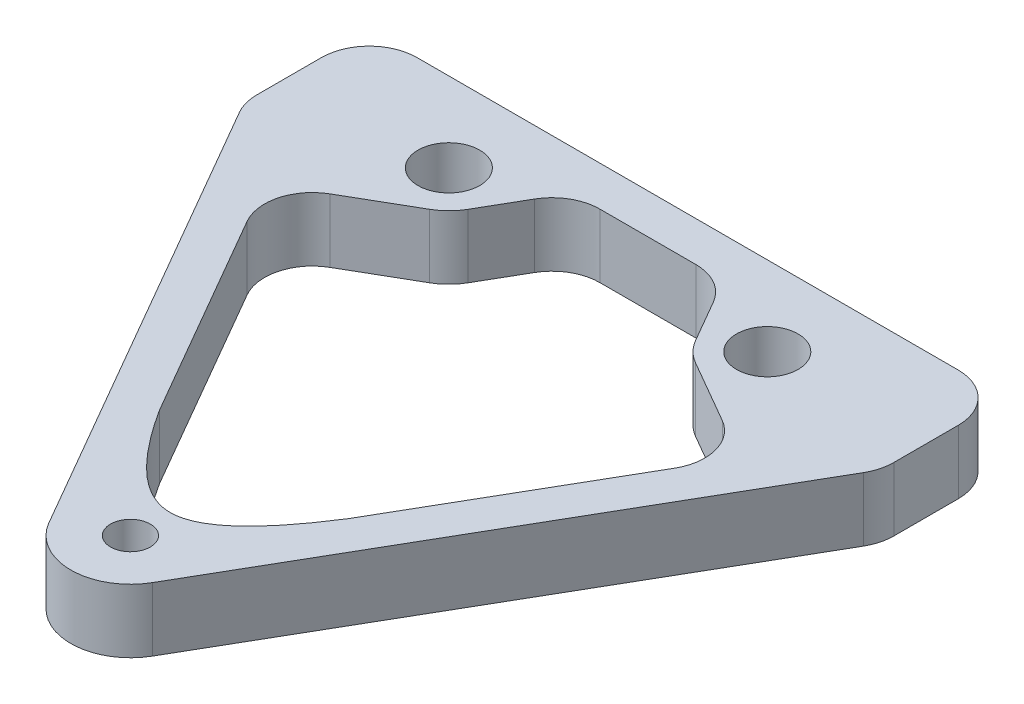
ISO-10303-21;
HEADER;
FILE_DESCRIPTION(('STEP AP214'),'2;1');
FILE_NAME('part.step','',(''),(''),'','','');
FILE_SCHEMA(('AUTOMOTIVE_DESIGN { 1 0 10303 214 1 1 1 1 }'));
ENDSEC;
DATA;
#1=APPLICATION_CONTEXT('core data for automotive mechanical design processes');
#2=APPLICATION_PROTOCOL_DEFINITION('international standard','automotive_design',2000,#1);
#3=PRODUCT_CONTEXT('',#1,'mechanical');
#4=PRODUCT('Part','Part','',(#3));
#5=PRODUCT_RELATED_PRODUCT_CATEGORY('part','',(#4));
#6=PRODUCT_DEFINITION_FORMATION('','',#4);
#7=PRODUCT_DEFINITION_CONTEXT('part definition',#1,'design');
#8=PRODUCT_DEFINITION('design','',#6,#7);
#9=PRODUCT_DEFINITION_SHAPE('','',#8);
#10=(LENGTH_UNIT() NAMED_UNIT(*) SI_UNIT(.MILLI.,.METRE.));
#11=(NAMED_UNIT(*) PLANE_ANGLE_UNIT() SI_UNIT($,.RADIAN.));
#12=(NAMED_UNIT(*) SI_UNIT($,.STERADIAN.) SOLID_ANGLE_UNIT());
#13=UNCERTAINTY_MEASURE_WITH_UNIT(LENGTH_MEASURE(1.E-05),#10,'distance_accuracy_value','');
#14=(GEOMETRIC_REPRESENTATION_CONTEXT(3) GLOBAL_UNCERTAINTY_ASSIGNED_CONTEXT((#13)) GLOBAL_UNIT_ASSIGNED_CONTEXT((#10,
#11,#12)) REPRESENTATION_CONTEXT('',''));
#15=CARTESIAN_POINT('',(0.,0.,0.));
#16=DIRECTION('',(0.,0.,1.));
#17=DIRECTION('',(1.,0.,0.));
#18=AXIS2_PLACEMENT_3D('',#15,#16,#17);
#19=CARTESIAN_POINT('',(0.,5.08,0.));
#20=DIRECTION('',(0.,1.,0.));
#21=DIRECTION('',(0.,0.,1.));
#22=AXIS2_PLACEMENT_3D('',#19,#20,#21);
#23=PLANE('',#22);
#24=CARTESIAN_POINT('',(0.,5.08,44.45));
#25=DIRECTION('',(0.,1.,0.));
#26=DIRECTION('',(0.,0.,1.));
#27=AXIS2_PLACEMENT_3D('',#24,#25,#26);
#28=CIRCLE('',#27,1.5875);
#29=CARTESIAN_POINT('',(0.,5.08,46.0375));
#30=VERTEX_POINT('',#29);
#31=EDGE_CURVE('E431',#30,#30,#28,.T.);
#32=ORIENTED_EDGE('',*,*,#31,.F.);
#33=EDGE_LOOP('',(#32));
#34=FACE_BOUND('',#33,.T.);
#35=CARTESIAN_POINT('',(-12.7,5.08,6.35));
#36=DIRECTION('',(0.,1.,0.));
#37=DIRECTION('',(0.,0.,1.));
#38=AXIS2_PLACEMENT_3D('',#35,#36,#37);
#39=CIRCLE('',#38,2.45745);
#40=CARTESIAN_POINT('',(-12.7,5.08,8.80745));
#41=VERTEX_POINT('',#40);
#42=EDGE_CURVE('E425',#41,#41,#39,.T.);
#43=ORIENTED_EDGE('',*,*,#42,.F.);
#44=EDGE_LOOP('',(#43));
#45=FACE_BOUND('',#44,.T.);
#46=CARTESIAN_POINT('',(12.7,5.08,6.35));
#47=DIRECTION('',(0.,1.,0.));
#48=DIRECTION('',(0.,0.,1.));
#49=AXIS2_PLACEMENT_3D('',#46,#47,#48);
#50=CIRCLE('',#49,2.45745);
#51=CARTESIAN_POINT('',(12.7,5.08,8.80745));
#52=VERTEX_POINT('',#51);
#53=EDGE_CURVE('E419',#52,#52,#50,.T.);
#54=ORIENTED_EDGE('',*,*,#53,.F.);
#55=EDGE_LOOP('',(#54));
#56=FACE_BOUND('',#55,.T.);
#57=DIRECTION('',(-0.499999999999998,0.,0.86602540378444));
#58=VECTOR('',#57,1.);
#59=CARTESIAN_POINT('',(23.3718605846325,5.08,13.4937499999999));
#60=LINE('',#59,#58);
#61=CARTESIAN_POINT('',(24.8895567884187,5.08,10.8650230645877));
#62=VERTEX_POINT('',#61);
#63=CARTESIAN_POINT('',(4.1244459855234,5.08,46.83125));
#64=VERTEX_POINT('',#63);
#65=EDGE_CURVE('E411',#62,#64,#60,.T.);
#66=ORIENTED_EDGE('',*,*,#65,.F.);
#67=CARTESIAN_POINT('',(21.59,5.08,8.96002306458772));
#68=DIRECTION('',(0.,1.,0.));
#69=DIRECTION('',(0.,0.,1.));
#70=AXIS2_PLACEMENT_3D('',#67,#68,#69);
#71=CIRCLE('',#70,3.81);
#72=CARTESIAN_POINT('',(25.4,5.08,8.96002306458772));
#73=VERTEX_POINT('',#72);
#74=EDGE_CURVE('E355',#62,#73,#71,.T.);
#75=ORIENTED_EDGE('',*,*,#74,.T.);
#76=DIRECTION('',(0.,0.,1.));
#77=VECTOR('',#76,1.);
#78=CARTESIAN_POINT('',(25.4,5.08,0.));
#79=LINE('',#78,#77);
#80=CARTESIAN_POINT('',(25.4,5.08,3.81));
#81=VERTEX_POINT('',#80);
#82=EDGE_CURVE('E408',#81,#73,#79,.T.);
#83=ORIENTED_EDGE('',*,*,#82,.F.);
#84=CARTESIAN_POINT('',(21.59,5.08,3.81));
#85=DIRECTION('',(0.,1.,0.));
#86=DIRECTION('',(0.,0.,1.));
#87=AXIS2_PLACEMENT_3D('',#84,#85,#86);
#88=CIRCLE('',#87,3.81);
#89=CARTESIAN_POINT('',(21.59,5.08,0.));
#90=VERTEX_POINT('',#89);
#91=EDGE_CURVE('E357',#81,#90,#88,.T.);
#92=ORIENTED_EDGE('',*,*,#91,.T.);
#93=DIRECTION('',(1.,0.,0.));
#94=VECTOR('',#93,1.);
#95=CARTESIAN_POINT('',(0.,5.08,0.));
#96=LINE('',#95,#94);
#97=CARTESIAN_POINT('',(-21.59,5.08,0.));
#98=VERTEX_POINT('',#97);
#99=EDGE_CURVE('E405',#98,#90,#96,.T.);
#100=ORIENTED_EDGE('',*,*,#99,.F.);
#101=CARTESIAN_POINT('',(-21.59,5.08,3.81));
#102=DIRECTION('',(0.,1.,0.));
#103=DIRECTION('',(0.,0.,1.));
#104=AXIS2_PLACEMENT_3D('',#101,#102,#103);
#105=CIRCLE('',#104,3.81);
#106=CARTESIAN_POINT('',(-25.4,5.08,3.81));
#107=VERTEX_POINT('',#106);
#108=EDGE_CURVE('E359',#98,#107,#105,.T.);
#109=ORIENTED_EDGE('',*,*,#108,.T.);
#110=DIRECTION('',(0.,0.,1.));
#111=VECTOR('',#110,1.);
#112=CARTESIAN_POINT('',(-25.4,5.08,0.));
#113=LINE('',#112,#111);
#114=CARTESIAN_POINT('',(-25.4,5.08,8.96002306458773));
#115=VERTEX_POINT('',#114);
#116=EDGE_CURVE('E384',#107,#115,#113,.T.);
#117=ORIENTED_EDGE('',*,*,#116,.T.);
#118=CARTESIAN_POINT('',(-21.59,5.08,8.96002306458773));
#119=DIRECTION('',(0.,1.,0.));
#120=DIRECTION('',(0.,0.,1.));
#121=AXIS2_PLACEMENT_3D('',#118,#119,#120);
#122=CIRCLE('',#121,3.81);
#123=CARTESIAN_POINT('',(-24.8895567884187,5.08,10.8650230645877));
#124=VERTEX_POINT('',#123);
#125=EDGE_CURVE('E361',#115,#124,#122,.T.);
#126=ORIENTED_EDGE('',*,*,#125,.T.);
#127=DIRECTION('',(0.499999999999998,0.,0.86602540378444));
#128=VECTOR('',#127,1.);
#129=CARTESIAN_POINT('',(-23.3718605846325,5.08,13.4937499999999));
#130=LINE('',#129,#128);
#131=CARTESIAN_POINT('',(-4.1244459855234,5.08,46.83125));
#132=VERTEX_POINT('',#131);
#133=EDGE_CURVE('E388',#124,#132,#130,.T.);
#134=ORIENTED_EDGE('',*,*,#133,.T.);
#135=CARTESIAN_POINT('',(0.,5.08,44.45));
#136=DIRECTION('',(0.,1.,0.));
#137=DIRECTION('',(0.,0.,1.));
#138=AXIS2_PLACEMENT_3D('',#135,#136,#137);
#139=CIRCLE('',#138,4.7625);
#140=EDGE_CURVE('E413',#132,#64,#139,.T.);
#141=ORIENTED_EDGE('',*,*,#140,.T.);
#142=EDGE_LOOP('',(#66,#75,#83,#92,#100,#109,#117,#126,#134,#141));
#143=FACE_BOUND('',#142,.T.);
#144=DIRECTION('',(0.499999999999998,0.,-0.86602540378444));
#145=VECTOR('',#144,1.);
#146=CARTESIAN_POINT('',(20.6222299276169,5.08,11.9062499999999));
#147=LINE('',#146,#145);
#148=CARTESIAN_POINT('',(7.50662638811654,5.08,34.6231417023449));
#149=VERTEX_POINT('',#148);
#150=CARTESIAN_POINT('',(17.0470992706013,5.08,18.098557941648));
#151=VERTEX_POINT('',#150);
#152=EDGE_CURVE('E463',#149,#151,#147,.T.);
#153=ORIENTED_EDGE('',*,*,#152,.F.);
#154=CARTESIAN_POINT('',(11.7999076642539,5.08,27.1869604008907));
#155=CARTESIAN_POINT('',(9.15149818445331,5.08,31.7741401791523));
#156=CARTESIAN_POINT('',(0.,5.08,50.7758598208477));
#157=CARTESIAN_POINT('',(-9.15149818445341,5.08,31.7741401791524));
#158=CARTESIAN_POINT('',(-11.7999076642539,5.08,27.1869604008907));
#159=B_SPLINE_CURVE_WITH_KNOTS('',3,(#154,#155,#156,#157,#158),.UNSPECIFIED.,.F.,.F.,(4,1,4),
(0.,0.5,1.),.UNSPECIFIED.);
#160=CARTESIAN_POINT('',(-7.50662638811593,5.08,34.6231417023459));
#161=VERTEX_POINT('',#160);
#162=EDGE_CURVE('E203',#149,#161,#159,.T.);
#163=ORIENTED_EDGE('',*,*,#162,.T.);
#164=DIRECTION('',(0.499999999999998,0.,0.86602540378444));
#165=VECTOR('',#164,1.);
#166=CARTESIAN_POINT('',(-20.6222299276169,5.08,11.9062499999999));
#167=LINE('',#166,#165);
#168=CARTESIAN_POINT('',(-17.0470992706013,5.08,18.098557941648));
#169=VERTEX_POINT('',#168);
#170=EDGE_CURVE('E220',#169,#161,#167,.T.);
#171=ORIENTED_EDGE('',*,*,#170,.F.);
#172=CARTESIAN_POINT('',(-13.7475424821826,5.08,16.1935579416481));
#173=DIRECTION('',(0.,1.,0.));
#174=DIRECTION('',(0.,0.,1.));
#175=AXIS2_PLACEMENT_3D('',#172,#173,#174);
#176=CIRCLE('',#175,3.81);
#177=CARTESIAN_POINT('',(-15.6525424821826,5.08,12.8940011532293));
#178=VERTEX_POINT('',#177);
#179=EDGE_CURVE('E316',#169,#178,#176,.F.);
#180=ORIENTED_EDGE('',*,*,#179,.T.);
#181=DIRECTION('',(-0.86602540378444,0.,0.499999999999998));
#182=VECTOR('',#181,1.);
#183=CARTESIAN_POINT('',(1.67013065701561,5.08,2.89275115322944));
#184=LINE('',#183,#182);
#185=CARTESIAN_POINT('',(-10.6045,5.08,9.97951246726059));
#186=VERTEX_POINT('',#185);
#187=EDGE_CURVE('E222',#186,#178,#184,.T.);
#188=ORIENTED_EDGE('',*,*,#187,.F.);
#189=CARTESIAN_POINT('',(-12.7,5.08,6.35));
#190=DIRECTION('',(0.,1.,0.));
#191=DIRECTION('',(0.,0.,1.));
#192=AXIS2_PLACEMENT_3D('',#189,#190,#191);
#193=CIRCLE('',#192,4.191);
#194=CARTESIAN_POINT('',(-9.07048753273941,5.08,8.44549999999999));
#195=VERTEX_POINT('',#194);
#196=EDGE_CURVE('E446',#186,#195,#193,.T.);
#197=ORIENTED_EDGE('',*,*,#196,.T.);
#198=DIRECTION('',(0.499999999999997,0.,-0.86602540378444));
#199=VECTOR('',#198,1.);
#200=CARTESIAN_POINT('',(-3.14585687572386,5.08,-1.81626131403119));
#201=LINE('',#200,#199);
#202=CARTESIAN_POINT('',(-7.12741520178175,5.08,5.08000000000002));
#203=VERTEX_POINT('',#202);
#204=EDGE_CURVE('E449',#195,#203,#201,.T.);
#205=ORIENTED_EDGE('',*,*,#204,.T.);
#206=CARTESIAN_POINT('',(-3.82785841336303,5.08,6.985));
#207=DIRECTION('',(0.,1.,0.));
#208=DIRECTION('',(0.,0.,1.));
#209=AXIS2_PLACEMENT_3D('',#206,#207,#208);
#210=CIRCLE('',#209,3.81);
#211=CARTESIAN_POINT('',(-3.82785841336303,5.08,3.175));
#212=VERTEX_POINT('',#211);
#213=EDGE_CURVE('E322',#203,#212,#210,.F.);
#214=ORIENTED_EDGE('',*,*,#213,.T.);
#215=DIRECTION('',(-1.,0.,0.));
#216=VECTOR('',#215,1.);
#217=CARTESIAN_POINT('',(0.,5.08,3.175));
#218=LINE('',#217,#216);
#219=CARTESIAN_POINT('',(3.82785841336303,5.08,3.175));
#220=VERTEX_POINT('',#219);
#221=EDGE_CURVE('E452',#220,#212,#218,.T.);
#222=ORIENTED_EDGE('',*,*,#221,.F.);
#223=CARTESIAN_POINT('',(3.82785841336303,5.08,6.985));
#224=DIRECTION('',(0.,1.,0.));
#225=DIRECTION('',(0.,0.,1.));
#226=AXIS2_PLACEMENT_3D('',#223,#224,#225);
#227=CIRCLE('',#226,3.81);
#228=CARTESIAN_POINT('',(7.12741520178175,5.08,5.08000000000001));
#229=VERTEX_POINT('',#228);
#230=EDGE_CURVE('E57',#220,#229,#227,.F.);
#231=ORIENTED_EDGE('',*,*,#230,.T.);
#232=DIRECTION('',(0.499999999999998,0.,0.86602540378444));
#233=VECTOR('',#232,1.);
#234=CARTESIAN_POINT('',(3.14585687572386,5.08,-1.81626131403119));
#235=LINE('',#234,#233);
#236=CARTESIAN_POINT('',(9.07048753273941,5.08,8.44549999999999));
#237=VERTEX_POINT('',#236);
#238=EDGE_CURVE('E455',#229,#237,#235,.T.);
#239=ORIENTED_EDGE('',*,*,#238,.T.);
#240=CARTESIAN_POINT('',(12.7,5.08,6.35));
#241=DIRECTION('',(0.,1.,0.));
#242=DIRECTION('',(0.,0.,1.));
#243=AXIS2_PLACEMENT_3D('',#240,#241,#242);
#244=CIRCLE('',#243,4.191);
#245=CARTESIAN_POINT('',(10.6045,5.08,9.97951246726059));
#246=VERTEX_POINT('',#245);
#247=EDGE_CURVE('E457',#237,#246,#244,.T.);
#248=ORIENTED_EDGE('',*,*,#247,.T.);
#249=DIRECTION('',(0.86602540378444,0.,0.499999999999997));
#250=VECTOR('',#249,1.);
#251=CARTESIAN_POINT('',(-1.67013065701561,5.08,2.89275115322944));
#252=LINE('',#251,#250);
#253=CARTESIAN_POINT('',(15.6525424821826,5.08,12.8940011532293));
#254=VERTEX_POINT('',#253);
#255=EDGE_CURVE('E460',#246,#254,#252,.T.);
#256=ORIENTED_EDGE('',*,*,#255,.T.);
#257=CARTESIAN_POINT('',(13.7475424821826,5.08,16.1935579416481));
#258=DIRECTION('',(0.,1.,0.));
#259=DIRECTION('',(0.,0.,1.));
#260=AXIS2_PLACEMENT_3D('',#257,#258,#259);
#261=CIRCLE('',#260,3.81);
#262=EDGE_CURVE('E43',#254,#151,#261,.F.);
#263=ORIENTED_EDGE('',*,*,#262,.T.);
#264=EDGE_LOOP('',(#153,#163,#171,#180,#188,#197,#205,#214,#222,#231,#239,#248,#256,#263));
#265=FACE_BOUND('',#264,.T.);
#266=ADVANCED_FACE('F35',(#34,#45,#56,#143,#265),#23,.T.);
#267=CARTESIAN_POINT('',(0.,0.,0.));
#268=DIRECTION('',(0.,1.,0.));
#269=DIRECTION('',(0.,0.,1.));
#270=AXIS2_PLACEMENT_3D('',#267,#268,#269);
#271=PLANE('',#270);
#272=DIRECTION('',(0.,0.,1.));
#273=VECTOR('',#272,1.);
#274=CARTESIAN_POINT('',(25.4,0.,0.));
#275=LINE('',#274,#273);
#276=CARTESIAN_POINT('',(25.4,0.,3.81));
#277=VERTEX_POINT('',#276);
#278=CARTESIAN_POINT('',(25.4,0.,8.96002306458772));
#279=VERTEX_POINT('',#278);
#280=EDGE_CURVE('E392',#277,#279,#275,.T.);
#281=ORIENTED_EDGE('',*,*,#280,.T.);
#282=CARTESIAN_POINT('',(21.59,0.,8.96002306458772));
#283=DIRECTION('',(0.,1.,0.));
#284=DIRECTION('',(0.,0.,1.));
#285=AXIS2_PLACEMENT_3D('',#282,#283,#284);
#286=CIRCLE('',#285,3.81);
#287=CARTESIAN_POINT('',(24.8895567884187,0.,10.8650230645877));
#288=VERTEX_POINT('',#287);
#289=EDGE_CURVE('E365',#279,#288,#286,.F.);
#290=ORIENTED_EDGE('',*,*,#289,.T.);
#291=DIRECTION('',(-0.499999999999998,0.,0.86602540378444));
#292=VECTOR('',#291,1.);
#293=CARTESIAN_POINT('',(23.3718605846325,0.,13.4937499999999));
#294=LINE('',#293,#292);
#295=CARTESIAN_POINT('',(4.1244459855234,0.,46.83125));
#296=VERTEX_POINT('',#295);
#297=EDGE_CURVE('E395',#288,#296,#294,.T.);
#298=ORIENTED_EDGE('',*,*,#297,.T.);
#299=CARTESIAN_POINT('',(0.,0.,44.45));
#300=DIRECTION('',(0.,1.,0.));
#301=DIRECTION('',(0.,0.,1.));
#302=AXIS2_PLACEMENT_3D('',#299,#300,#301);
#303=CIRCLE('',#302,4.7625);
#304=CARTESIAN_POINT('',(-4.1244459855234,0.,46.83125));
#305=VERTEX_POINT('',#304);
#306=EDGE_CURVE('E397',#305,#296,#303,.T.);
#307=ORIENTED_EDGE('',*,*,#306,.F.);
#308=DIRECTION('',(0.499999999999998,0.,0.86602540378444));
#309=VECTOR('',#308,1.);
#310=CARTESIAN_POINT('',(-23.3718605846325,0.,13.4937499999999));
#311=LINE('',#310,#309);
#312=CARTESIAN_POINT('',(-24.8895567884187,0.,10.8650230645877));
#313=VERTEX_POINT('',#312);
#314=EDGE_CURVE('E400',#313,#305,#311,.T.);
#315=ORIENTED_EDGE('',*,*,#314,.F.);
#316=CARTESIAN_POINT('',(-21.59,0.,8.96002306458773));
#317=DIRECTION('',(0.,1.,0.));
#318=DIRECTION('',(0.,0.,1.));
#319=AXIS2_PLACEMENT_3D('',#316,#317,#318);
#320=CIRCLE('',#319,3.81);
#321=CARTESIAN_POINT('',(-25.4,0.,8.96002306458773));
#322=VERTEX_POINT('',#321);
#323=EDGE_CURVE('E371',#313,#322,#320,.F.);
#324=ORIENTED_EDGE('',*,*,#323,.T.);
#325=DIRECTION('',(0.,0.,1.));
#326=VECTOR('',#325,1.);
#327=CARTESIAN_POINT('',(-25.4,0.,0.));
#328=LINE('',#327,#326);
#329=CARTESIAN_POINT('',(-25.4,0.,3.81));
#330=VERTEX_POINT('',#329);
#331=EDGE_CURVE('E385',#330,#322,#328,.T.);
#332=ORIENTED_EDGE('',*,*,#331,.F.);
#333=CARTESIAN_POINT('',(-21.59,0.,3.81));
#334=DIRECTION('',(0.,1.,0.));
#335=DIRECTION('',(0.,0.,1.));
#336=AXIS2_PLACEMENT_3D('',#333,#334,#335);
#337=CIRCLE('',#336,3.81);
#338=CARTESIAN_POINT('',(-21.59,0.,0.));
#339=VERTEX_POINT('',#338);
#340=EDGE_CURVE('E369',#330,#339,#337,.F.);
#341=ORIENTED_EDGE('',*,*,#340,.T.);
#342=DIRECTION('',(1.,0.,0.));
#343=VECTOR('',#342,1.);
#344=CARTESIAN_POINT('',(0.,0.,0.));
#345=LINE('',#344,#343);
#346=CARTESIAN_POINT('',(21.59,0.,0.));
#347=VERTEX_POINT('',#346);
#348=EDGE_CURVE('E389',#339,#347,#345,.T.);
#349=ORIENTED_EDGE('',*,*,#348,.T.);
#350=CARTESIAN_POINT('',(21.59,0.,3.81));
#351=DIRECTION('',(0.,1.,0.));
#352=DIRECTION('',(0.,0.,1.));
#353=AXIS2_PLACEMENT_3D('',#350,#351,#352);
#354=CIRCLE('',#353,3.81);
#355=EDGE_CURVE('E367',#347,#277,#354,.F.);
#356=ORIENTED_EDGE('',*,*,#355,.T.);
#357=EDGE_LOOP('',(#281,#290,#298,#307,#315,#324,#332,#341,#349,#356));
#358=FACE_BOUND('',#357,.T.);
#359=CARTESIAN_POINT('',(12.7,0.,6.35));
#360=DIRECTION('',(0.,1.,0.));
#361=DIRECTION('',(0.,0.,1.));
#362=AXIS2_PLACEMENT_3D('',#359,#360,#361);
#363=CIRCLE('',#362,2.45745);
#364=CARTESIAN_POINT('',(12.7,0.,8.80745));
#365=VERTEX_POINT('',#364);
#366=EDGE_CURVE('E402',#365,#365,#363,.T.);
#367=ORIENTED_EDGE('',*,*,#366,.T.);
#368=EDGE_LOOP('',(#367));
#369=FACE_BOUND('',#368,.T.);
#370=CARTESIAN_POINT('',(-12.7,0.,6.35));
#371=DIRECTION('',(0.,1.,0.));
#372=DIRECTION('',(0.,0.,1.));
#373=AXIS2_PLACEMENT_3D('',#370,#371,#372);
#374=CIRCLE('',#373,2.45745);
#375=CARTESIAN_POINT('',(-12.7,0.,8.80745));
#376=VERTEX_POINT('',#375);
#377=EDGE_CURVE('E422',#376,#376,#374,.T.);
#378=ORIENTED_EDGE('',*,*,#377,.T.);
#379=EDGE_LOOP('',(#378));
#380=FACE_BOUND('',#379,.T.);
#381=CARTESIAN_POINT('',(0.,0.,44.45));
#382=DIRECTION('',(0.,1.,0.));
#383=DIRECTION('',(0.,0.,1.));
#384=AXIS2_PLACEMENT_3D('',#381,#382,#383);
#385=CIRCLE('',#384,1.5875);
#386=CARTESIAN_POINT('',(0.,0.,46.0375));
#387=VERTEX_POINT('',#386);
#388=EDGE_CURVE('E428',#387,#387,#385,.T.);
#389=ORIENTED_EDGE('',*,*,#388,.T.);
#390=EDGE_LOOP('',(#389));
#391=FACE_BOUND('',#390,.T.);
#392=CARTESIAN_POINT('',(11.7999076642539,0.,27.1869604008907));
#393=CARTESIAN_POINT('',(9.15149818445331,0.,31.7741401791523));
#394=CARTESIAN_POINT('',(0.,0.,50.7758598208477));
#395=CARTESIAN_POINT('',(-9.15149818445341,0.,31.7741401791524));
#396=CARTESIAN_POINT('',(-11.7999076642539,0.,27.1869604008907));
#397=B_SPLINE_CURVE_WITH_KNOTS('',3,(#392,#393,#394,#395,#396),.UNSPECIFIED.,.F.,.F.,(4,1,4),
(0.,0.5,1.),.UNSPECIFIED.);
#398=CARTESIAN_POINT('',(7.50662638811654,0.,34.6231417023449));
#399=VERTEX_POINT('',#398);
#400=CARTESIAN_POINT('',(-7.50662638811593,0.,34.6231417023459));
#401=VERTEX_POINT('',#400);
#402=EDGE_CURVE('E200',#399,#401,#397,.T.);
#403=ORIENTED_EDGE('',*,*,#402,.F.);
#404=DIRECTION('',(0.499999999999998,0.,-0.86602540378444));
#405=VECTOR('',#404,1.);
#406=CARTESIAN_POINT('',(20.6222299276169,0.,11.9062499999999));
#407=LINE('',#406,#405);
#408=CARTESIAN_POINT('',(17.0470992706013,0.,18.098557941648));
#409=VERTEX_POINT('',#408);
#410=EDGE_CURVE('E211',#399,#409,#407,.T.);
#411=ORIENTED_EDGE('',*,*,#410,.T.);
#412=CARTESIAN_POINT('',(13.7475424821826,0.,16.1935579416481));
#413=DIRECTION('',(0.,1.,0.));
#414=DIRECTION('',(0.,0.,1.));
#415=AXIS2_PLACEMENT_3D('',#412,#413,#414);
#416=CIRCLE('',#415,3.81);
#417=CARTESIAN_POINT('',(15.6525424821826,0.,12.8940011532293));
#418=VERTEX_POINT('',#417);
#419=EDGE_CURVE('E11',#409,#418,#416,.T.);
#420=ORIENTED_EDGE('',*,*,#419,.T.);
#421=DIRECTION('',(0.86602540378444,0.,0.499999999999997));
#422=VECTOR('',#421,1.);
#423=CARTESIAN_POINT('',(-1.67013065701561,0.,2.89275115322944));
#424=LINE('',#423,#422);
#425=CARTESIAN_POINT('',(10.6045,0.,9.97951246726059));
#426=VERTEX_POINT('',#425);
#427=EDGE_CURVE('E216',#426,#418,#424,.T.);
#428=ORIENTED_EDGE('',*,*,#427,.F.);
#429=CARTESIAN_POINT('',(12.7,0.,6.35));
#430=DIRECTION('',(0.,1.,0.));
#431=DIRECTION('',(0.,0.,1.));
#432=AXIS2_PLACEMENT_3D('',#429,#430,#431);
#433=CIRCLE('',#432,4.191);
#434=CARTESIAN_POINT('',(9.07048753273941,0.,8.44549999999999));
#435=VERTEX_POINT('',#434);
#436=EDGE_CURVE('E484',#435,#426,#433,.T.);
#437=ORIENTED_EDGE('',*,*,#436,.F.);
#438=DIRECTION('',(0.499999999999998,0.,0.86602540378444));
#439=VECTOR('',#438,1.);
#440=CARTESIAN_POINT('',(3.14585687572386,0.,-1.81626131403119));
#441=LINE('',#440,#439);
#442=CARTESIAN_POINT('',(7.12741520178175,0.,5.08000000000001));
#443=VERTEX_POINT('',#442);
#444=EDGE_CURVE('E482',#443,#435,#441,.T.);
#445=ORIENTED_EDGE('',*,*,#444,.F.);
#446=CARTESIAN_POINT('',(3.82785841336303,0.,6.985));
#447=DIRECTION('',(0.,1.,0.));
#448=DIRECTION('',(0.,0.,1.));
#449=AXIS2_PLACEMENT_3D('',#446,#447,#448);
#450=CIRCLE('',#449,3.81);
#451=CARTESIAN_POINT('',(3.82785841336303,0.,3.175));
#452=VERTEX_POINT('',#451);
#453=EDGE_CURVE('E324',#443,#452,#450,.T.);
#454=ORIENTED_EDGE('',*,*,#453,.T.);
#455=DIRECTION('',(-1.,0.,0.));
#456=VECTOR('',#455,1.);
#457=CARTESIAN_POINT('',(0.,0.,3.175));
#458=LINE('',#457,#456);
#459=CARTESIAN_POINT('',(-3.82785841336303,0.,3.175));
#460=VERTEX_POINT('',#459);
#461=EDGE_CURVE('E479',#452,#460,#458,.T.);
#462=ORIENTED_EDGE('',*,*,#461,.T.);
#463=CARTESIAN_POINT('',(-3.82785841336303,0.,6.985));
#464=DIRECTION('',(0.,1.,0.));
#465=DIRECTION('',(0.,0.,1.));
#466=AXIS2_PLACEMENT_3D('',#463,#464,#465);
#467=CIRCLE('',#466,3.81);
#468=CARTESIAN_POINT('',(-7.12741520178175,0.,5.08000000000002));
#469=VERTEX_POINT('',#468);
#470=EDGE_CURVE('E318',#460,#469,#467,.T.);
#471=ORIENTED_EDGE('',*,*,#470,.T.);
#472=DIRECTION('',(0.499999999999997,0.,-0.86602540378444));
#473=VECTOR('',#472,1.);
#474=CARTESIAN_POINT('',(-3.14585687572386,0.,-1.81626131403119));
#475=LINE('',#474,#473);
#476=CARTESIAN_POINT('',(-9.07048753273941,0.,8.44549999999999));
#477=VERTEX_POINT('',#476);
#478=EDGE_CURVE('E476',#477,#469,#475,.T.);
#479=ORIENTED_EDGE('',*,*,#478,.F.);
#480=CARTESIAN_POINT('',(-12.7,0.,6.35));
#481=DIRECTION('',(0.,1.,0.));
#482=DIRECTION('',(0.,0.,1.));
#483=AXIS2_PLACEMENT_3D('',#480,#481,#482);
#484=CIRCLE('',#483,4.191);
#485=CARTESIAN_POINT('',(-10.6045,0.,9.97951246726059));
#486=VERTEX_POINT('',#485);
#487=EDGE_CURVE('E474',#486,#477,#484,.T.);
#488=ORIENTED_EDGE('',*,*,#487,.F.);
#489=DIRECTION('',(-0.86602540378444,0.,0.499999999999998));
#490=VECTOR('',#489,1.);
#491=CARTESIAN_POINT('',(1.67013065701561,0.,2.89275115322944));
#492=LINE('',#491,#490);
#493=CARTESIAN_POINT('',(-15.6525424821826,0.,12.8940011532293));
#494=VERTEX_POINT('',#493);
#495=EDGE_CURVE('E472',#486,#494,#492,.T.);
#496=ORIENTED_EDGE('',*,*,#495,.T.);
#497=CARTESIAN_POINT('',(-13.7475424821826,0.,16.1935579416481));
#498=DIRECTION('',(0.,1.,0.));
#499=DIRECTION('',(0.,0.,1.));
#500=AXIS2_PLACEMENT_3D('',#497,#498,#499);
#501=CIRCLE('',#500,3.81);
#502=CARTESIAN_POINT('',(-17.0470992706013,0.,18.098557941648));
#503=VERTEX_POINT('',#502);
#504=EDGE_CURVE('E311',#494,#503,#501,.T.);
#505=ORIENTED_EDGE('',*,*,#504,.T.);
#506=DIRECTION('',(0.499999999999998,0.,0.86602540378444));
#507=VECTOR('',#506,1.);
#508=CARTESIAN_POINT('',(-20.6222299276169,0.,11.9062499999999));
#509=LINE('',#508,#507);
#510=EDGE_CURVE('E208',#503,#401,#509,.T.);
#511=ORIENTED_EDGE('',*,*,#510,.T.);
#512=EDGE_LOOP('',(#403,#411,#420,#428,#437,#445,#454,#462,#471,#479,#488,#496,#505,#511));
#513=FACE_BOUND('',#512,.T.);
#514=ADVANCED_FACE('F218',(#358,#369,#380,#391,#513),#271,.F.);
#515=CARTESIAN_POINT('',(-23.3718605846325,5.08,13.4937499999999));
#516=DIRECTION('',(0.86602540378444,0.,-0.499999999999998));
#517=DIRECTION('',(-0.499999999999998,0.,-0.86602540378444));
#518=AXIS2_PLACEMENT_3D('',#515,#516,#517);
#519=PLANE('',#518);
#520=ORIENTED_EDGE('',*,*,#133,.F.);
#521=DIRECTION('',(0.,-1.,0.));
#522=VECTOR('',#521,1.);
#523=CARTESIAN_POINT('',(-24.8895567884187,5.08,10.8650230645877));
#524=LINE('',#523,#522);
#525=EDGE_CURVE('E342',#124,#313,#524,.T.);
#526=ORIENTED_EDGE('',*,*,#525,.T.);
#527=ORIENTED_EDGE('',*,*,#314,.T.);
#528=DIRECTION('',(0.,-1.,0.));
#529=VECTOR('',#528,1.);
#530=CARTESIAN_POINT('',(-4.1244459855234,5.08,46.83125));
#531=LINE('',#530,#529);
#532=EDGE_CURVE('E378',#132,#305,#531,.T.);
#533=ORIENTED_EDGE('',*,*,#532,.F.);
#534=EDGE_LOOP('',(#520,#526,#527,#533));
#535=FACE_BOUND('',#534,.T.);
#536=ADVANCED_FACE('F255',(#535),#519,.F.);
#537=CARTESIAN_POINT('',(0.,5.08,44.45));
#538=DIRECTION('',(0.,-1.,0.));
#539=DIRECTION('',(0.,0.,-1.));
#540=AXIS2_PLACEMENT_3D('',#537,#538,#539);
#541=CYLINDRICAL_SURFACE('',#540,4.7625);
#542=ORIENTED_EDGE('',*,*,#306,.T.);
#543=DIRECTION('',(0.,-1.,0.));
#544=VECTOR('',#543,1.);
#545=CARTESIAN_POINT('',(4.1244459855234,5.08,46.83125));
#546=LINE('',#545,#544);
#547=EDGE_CURVE('E381',#64,#296,#546,.T.);
#548=ORIENTED_EDGE('',*,*,#547,.F.);
#549=ORIENTED_EDGE('',*,*,#140,.F.);
#550=ORIENTED_EDGE('',*,*,#532,.T.);
#551=EDGE_LOOP('',(#542,#548,#549,#550));
#552=FACE_BOUND('',#551,.T.);
#553=ADVANCED_FACE('F271',(#552),#541,.T.);
#554=CARTESIAN_POINT('',(23.3718605846325,5.08,13.4937499999999));
#555=DIRECTION('',(0.86602540378444,0.,0.499999999999998));
#556=DIRECTION('',(0.499999999999998,0.,-0.86602540378444));
#557=AXIS2_PLACEMENT_3D('',#554,#555,#556);
#558=PLANE('',#557);
#559=ORIENTED_EDGE('',*,*,#297,.F.);
#560=DIRECTION('',(0.,-1.,0.));
#561=VECTOR('',#560,1.);
#562=CARTESIAN_POINT('',(24.8895567884187,5.08,10.8650230645877));
#563=LINE('',#562,#561);
#564=EDGE_CURVE('E363',#288,#62,#563,.F.);
#565=ORIENTED_EDGE('',*,*,#564,.T.);
#566=ORIENTED_EDGE('',*,*,#65,.T.);
#567=ORIENTED_EDGE('',*,*,#547,.T.);
#568=EDGE_LOOP('',(#559,#565,#566,#567));
#569=FACE_BOUND('',#568,.T.);
#570=ADVANCED_FACE('F267',(#569),#558,.T.);
#571=CARTESIAN_POINT('',(25.4,5.08,0.));
#572=DIRECTION('',(1.,0.,0.));
#573=DIRECTION('',(0.,0.,-1.));
#574=AXIS2_PLACEMENT_3D('',#571,#572,#573);
#575=PLANE('',#574);
#576=ORIENTED_EDGE('',*,*,#82,.T.);
#577=DIRECTION('',(0.,-1.,0.));
#578=VECTOR('',#577,1.);
#579=CARTESIAN_POINT('',(25.4,5.08,8.96002306458772));
#580=LINE('',#579,#578);
#581=EDGE_CURVE('E373',#73,#279,#580,.T.);
#582=ORIENTED_EDGE('',*,*,#581,.T.);
#583=ORIENTED_EDGE('',*,*,#280,.F.);
#584=DIRECTION('',(0.,-1.,0.));
#585=VECTOR('',#584,1.);
#586=CARTESIAN_POINT('',(25.4,5.08,3.81));
#587=LINE('',#586,#585);
#588=EDGE_CURVE('E376',#277,#81,#587,.F.);
#589=ORIENTED_EDGE('',*,*,#588,.T.);
#590=EDGE_LOOP('',(#576,#582,#583,#589));
#591=FACE_BOUND('',#590,.T.);
#592=ADVANCED_FACE('F263',(#591),#575,.T.);
#593=CARTESIAN_POINT('',(0.,5.08,0.));
#594=DIRECTION('',(0.,0.,-1.));
#595=DIRECTION('',(-1.,0.,0.));
#596=AXIS2_PLACEMENT_3D('',#593,#594,#595);
#597=PLANE('',#596);
#598=ORIENTED_EDGE('',*,*,#99,.T.);
#599=DIRECTION('',(0.,-1.,0.));
#600=VECTOR('',#599,1.);
#601=CARTESIAN_POINT('',(21.59,5.08,0.));
#602=LINE('',#601,#600);
#603=EDGE_CURVE('E350',#90,#347,#602,.T.);
#604=ORIENTED_EDGE('',*,*,#603,.T.);
#605=ORIENTED_EDGE('',*,*,#348,.F.);
#606=DIRECTION('',(0.,-1.,0.));
#607=VECTOR('',#606,1.);
#608=CARTESIAN_POINT('',(-21.59,5.08,0.));
#609=LINE('',#608,#607);
#610=EDGE_CURVE('E353',#339,#98,#609,.F.);
#611=ORIENTED_EDGE('',*,*,#610,.T.);
#612=EDGE_LOOP('',(#598,#604,#605,#611));
#613=FACE_BOUND('',#612,.T.);
#614=ADVANCED_FACE('F259',(#613),#597,.T.);
#615=CARTESIAN_POINT('',(-25.4,5.08,0.));
#616=DIRECTION('',(1.,0.,0.));
#617=DIRECTION('',(0.,0.,-1.));
#618=AXIS2_PLACEMENT_3D('',#615,#616,#617);
#619=PLANE('',#618);
#620=ORIENTED_EDGE('',*,*,#116,.F.);
#621=DIRECTION('',(0.,-1.,0.));
#622=VECTOR('',#621,1.);
#623=CARTESIAN_POINT('',(-25.4,0.,3.81));
#624=LINE('',#623,#622);
#625=EDGE_CURVE('E345',#107,#330,#624,.T.);
#626=ORIENTED_EDGE('',*,*,#625,.T.);
#627=ORIENTED_EDGE('',*,*,#331,.T.);
#628=DIRECTION('',(0.,-1.,0.));
#629=VECTOR('',#628,1.);
#630=CARTESIAN_POINT('',(-25.4,5.08,8.96002306458773));
#631=LINE('',#630,#629);
#632=EDGE_CURVE('E348',#322,#115,#631,.F.);
#633=ORIENTED_EDGE('',*,*,#632,.T.);
#634=EDGE_LOOP('',(#620,#626,#627,#633));
#635=FACE_BOUND('',#634,.T.);
#636=ADVANCED_FACE('F248',(#635),#619,.F.);
#637=CARTESIAN_POINT('',(12.7,5.08,6.35));
#638=DIRECTION('',(0.,1.,0.));
#639=DIRECTION('',(0.,0.,1.));
#640=AXIS2_PLACEMENT_3D('',#637,#638,#639);
#641=CYLINDRICAL_SURFACE('',#640,2.45745);
#642=ORIENTED_EDGE('',*,*,#366,.F.);
#643=EDGE_LOOP('',(#642));
#644=FACE_BOUND('',#643,.T.);
#645=ORIENTED_EDGE('',*,*,#53,.T.);
#646=EDGE_LOOP('',(#645));
#647=FACE_BOUND('',#646,.T.);
#648=ADVANCED_FACE('F244',(#644,#647),#641,.F.);
#649=CARTESIAN_POINT('',(-12.7,5.08,6.35));
#650=DIRECTION('',(0.,1.,0.));
#651=DIRECTION('',(0.,0.,1.));
#652=AXIS2_PLACEMENT_3D('',#649,#650,#651);
#653=CYLINDRICAL_SURFACE('',#652,2.45745);
#654=ORIENTED_EDGE('',*,*,#377,.F.);
#655=EDGE_LOOP('',(#654));
#656=FACE_BOUND('',#655,.T.);
#657=ORIENTED_EDGE('',*,*,#42,.T.);
#658=EDGE_LOOP('',(#657));
#659=FACE_BOUND('',#658,.T.);
#660=ADVANCED_FACE('F240',(#656,#659),#653,.F.);
#661=CARTESIAN_POINT('',(0.,5.08,44.45));
#662=DIRECTION('',(0.,1.,0.));
#663=DIRECTION('',(0.,0.,1.));
#664=AXIS2_PLACEMENT_3D('',#661,#662,#663);
#665=CYLINDRICAL_SURFACE('',#664,1.5875);
#666=ORIENTED_EDGE('',*,*,#388,.F.);
#667=EDGE_LOOP('',(#666));
#668=FACE_BOUND('',#667,.T.);
#669=ORIENTED_EDGE('',*,*,#31,.T.);
#670=EDGE_LOOP('',(#669));
#671=FACE_BOUND('',#670,.T.);
#672=ADVANCED_FACE('F236',(#668,#671),#665,.F.);
#673=DIRECTION('',(0.,1.,0.));
#674=VECTOR('',#673,1.);
#675=SURFACE_OF_LINEAR_EXTRUSION('',#397,#674);
#676=ORIENTED_EDGE('',*,*,#162,.F.);
#677=DIRECTION('',(0.,1.,0.));
#678=VECTOR('',#677,1.);
#679=CARTESIAN_POINT('',(7.50662638811654,0.,34.6231417023449));
#680=LINE('',#679,#678);
#681=EDGE_CURVE('E195',#399,#149,#680,.T.);
#682=ORIENTED_EDGE('',*,*,#681,.F.);
#683=ORIENTED_EDGE('',*,*,#402,.T.);
#684=DIRECTION('',(0.,1.,0.));
#685=VECTOR('',#684,1.);
#686=CARTESIAN_POINT('',(-7.50662638811593,0.,34.6231417023459));
#687=LINE('',#686,#685);
#688=EDGE_CURVE('E433',#401,#161,#687,.T.);
#689=ORIENTED_EDGE('',*,*,#688,.T.);
#690=EDGE_LOOP('',(#676,#682,#683,#689));
#691=FACE_BOUND('',#690,.T.);
#692=ADVANCED_FACE('F197',(#691),#675,.T.);
#693=CARTESIAN_POINT('',(-20.6222299276169,0.,11.9062499999999));
#694=DIRECTION('',(-0.86602540378444,0.,0.499999999999998));
#695=DIRECTION('',(0.499999999999998,0.,0.86602540378444));
#696=AXIS2_PLACEMENT_3D('',#693,#694,#695);
#697=PLANE('',#696);
#698=ORIENTED_EDGE('',*,*,#510,.F.);
#699=DIRECTION('',(0.,1.,0.));
#700=VECTOR('',#699,1.);
#701=CARTESIAN_POINT('',(-17.0470992706013,5.08,18.098557941648));
#702=LINE('',#701,#700);
#703=EDGE_CURVE('E314',#503,#169,#702,.T.);
#704=ORIENTED_EDGE('',*,*,#703,.T.);
#705=ORIENTED_EDGE('',*,*,#170,.T.);
#706=ORIENTED_EDGE('',*,*,#688,.F.);
#707=EDGE_LOOP('',(#698,#704,#705,#706));
#708=FACE_BOUND('',#707,.T.);
#709=ADVANCED_FACE('F235',(#708),#697,.F.);
#710=CARTESIAN_POINT('',(1.67013065701561,0.,2.89275115322944));
#711=DIRECTION('',(-0.499999999999998,0.,-0.86602540378444));
#712=DIRECTION('',(-0.86602540378444,0.,0.499999999999998));
#713=AXIS2_PLACEMENT_3D('',#710,#711,#712);
#714=PLANE('',#713);
#715=ORIENTED_EDGE('',*,*,#187,.T.);
#716=DIRECTION('',(0.,1.,0.));
#717=VECTOR('',#716,1.);
#718=CARTESIAN_POINT('',(-15.6525424821826,0.,12.8940011532293));
#719=LINE('',#718,#717);
#720=EDGE_CURVE('E312',#178,#494,#719,.F.);
#721=ORIENTED_EDGE('',*,*,#720,.T.);
#722=ORIENTED_EDGE('',*,*,#495,.F.);
#723=DIRECTION('',(0.,1.,0.));
#724=VECTOR('',#723,1.);
#725=CARTESIAN_POINT('',(-10.6045,0.,9.97951246726059));
#726=LINE('',#725,#724);
#727=EDGE_CURVE('E441',#486,#186,#726,.T.);
#728=ORIENTED_EDGE('',*,*,#727,.T.);
#729=EDGE_LOOP('',(#715,#721,#722,#728));
#730=FACE_BOUND('',#729,.T.);
#731=ADVANCED_FACE('F520',(#730),#714,.F.);
#732=CARTESIAN_POINT('',(-12.7,0.,6.35));
#733=DIRECTION('',(0.,1.,0.));
#734=DIRECTION('',(0.,0.,1.));
#735=AXIS2_PLACEMENT_3D('',#732,#733,#734);
#736=CYLINDRICAL_SURFACE('',#735,4.191);
#737=ORIENTED_EDGE('',*,*,#196,.F.);
#738=ORIENTED_EDGE('',*,*,#727,.F.);
#739=ORIENTED_EDGE('',*,*,#487,.T.);
#740=DIRECTION('',(0.,1.,0.));
#741=VECTOR('',#740,1.);
#742=CARTESIAN_POINT('',(-9.07048753273941,0.,8.44549999999999));
#743=LINE('',#742,#741);
#744=EDGE_CURVE('E439',#477,#195,#743,.T.);
#745=ORIENTED_EDGE('',*,*,#744,.T.);
#746=EDGE_LOOP('',(#737,#738,#739,#745));
#747=FACE_BOUND('',#746,.T.);
#748=ADVANCED_FACE('F516',(#747),#736,.T.);
#749=CARTESIAN_POINT('',(-3.14585687572386,0.,-1.81626131403119));
#750=DIRECTION('',(0.86602540378444,0.,0.499999999999997));
#751=DIRECTION('',(0.499999999999997,0.,-0.86602540378444));
#752=AXIS2_PLACEMENT_3D('',#749,#750,#751);
#753=PLANE('',#752);
#754=ORIENTED_EDGE('',*,*,#478,.T.);
#755=DIRECTION('',(0.,1.,0.));
#756=VECTOR('',#755,1.);
#757=CARTESIAN_POINT('',(-7.12741520178175,0.,5.08000000000001));
#758=LINE('',#757,#756);
#759=EDGE_CURVE('E332',#469,#203,#758,.T.);
#760=ORIENTED_EDGE('',*,*,#759,.T.);
#761=ORIENTED_EDGE('',*,*,#204,.F.);
#762=ORIENTED_EDGE('',*,*,#744,.F.);
#763=EDGE_LOOP('',(#754,#760,#761,#762));
#764=FACE_BOUND('',#763,.T.);
#765=ADVANCED_FACE('F512',(#764),#753,.T.);
#766=CARTESIAN_POINT('',(0.,0.,3.175));
#767=DIRECTION('',(0.,0.,-1.));
#768=DIRECTION('',(-1.,0.,0.));
#769=AXIS2_PLACEMENT_3D('',#766,#767,#768);
#770=PLANE('',#769);
#771=ORIENTED_EDGE('',*,*,#461,.F.);
#772=DIRECTION('',(0.,1.,0.));
#773=VECTOR('',#772,1.);
#774=CARTESIAN_POINT('',(3.82785841336303,0.,3.175));
#775=LINE('',#774,#773);
#776=EDGE_CURVE('E337',#452,#220,#775,.T.);
#777=ORIENTED_EDGE('',*,*,#776,.T.);
#778=ORIENTED_EDGE('',*,*,#221,.T.);
#779=DIRECTION('',(0.,1.,0.));
#780=VECTOR('',#779,1.);
#781=CARTESIAN_POINT('',(-3.82785841336303,0.,3.175));
#782=LINE('',#781,#780);
#783=EDGE_CURVE('E340',#212,#460,#782,.F.);
#784=ORIENTED_EDGE('',*,*,#783,.T.);
#785=EDGE_LOOP('',(#771,#777,#778,#784));
#786=FACE_BOUND('',#785,.T.);
#787=ADVANCED_FACE('F505',(#786),#770,.F.);
#788=CARTESIAN_POINT('',(3.14585687572386,0.,-1.81626131403119));
#789=DIRECTION('',(-0.86602540378444,0.,0.499999999999998));
#790=DIRECTION('',(0.499999999999998,0.,0.86602540378444));
#791=AXIS2_PLACEMENT_3D('',#788,#789,#790);
#792=PLANE('',#791);
#793=ORIENTED_EDGE('',*,*,#238,.F.);
#794=DIRECTION('',(0.,1.,0.));
#795=VECTOR('',#794,1.);
#796=CARTESIAN_POINT('',(7.12741520178175,0.,5.08000000000001));
#797=LINE('',#796,#795);
#798=EDGE_CURVE('E335',#229,#443,#797,.F.);
#799=ORIENTED_EDGE('',*,*,#798,.T.);
#800=ORIENTED_EDGE('',*,*,#444,.T.);
#801=DIRECTION('',(0.,1.,0.));
#802=VECTOR('',#801,1.);
#803=CARTESIAN_POINT('',(9.07048753273941,0.,8.44549999999999));
#804=LINE('',#803,#802);
#805=EDGE_CURVE('E436',#435,#237,#804,.T.);
#806=ORIENTED_EDGE('',*,*,#805,.T.);
#807=EDGE_LOOP('',(#793,#799,#800,#806));
#808=FACE_BOUND('',#807,.T.);
#809=ADVANCED_FACE('F499',(#808),#792,.T.);
#810=CARTESIAN_POINT('',(12.7,0.,6.35));
#811=DIRECTION('',(0.,1.,0.));
#812=DIRECTION('',(0.,0.,1.));
#813=AXIS2_PLACEMENT_3D('',#810,#811,#812);
#814=CYLINDRICAL_SURFACE('',#813,4.191);
#815=ORIENTED_EDGE('',*,*,#247,.F.);
#816=ORIENTED_EDGE('',*,*,#805,.F.);
#817=ORIENTED_EDGE('',*,*,#436,.T.);
#818=DIRECTION('',(0.,1.,0.));
#819=VECTOR('',#818,1.);
#820=CARTESIAN_POINT('',(10.6045,0.,9.97951246726059));
#821=LINE('',#820,#819);
#822=EDGE_CURVE('E207',#426,#246,#821,.T.);
#823=ORIENTED_EDGE('',*,*,#822,.T.);
#824=EDGE_LOOP('',(#815,#816,#817,#823));
#825=FACE_BOUND('',#824,.T.);
#826=ADVANCED_FACE('F497',(#825),#814,.T.);
#827=CARTESIAN_POINT('',(-1.67013065701561,0.,2.89275115322944));
#828=DIRECTION('',(-0.499999999999997,0.,0.86602540378444));
#829=DIRECTION('',(0.86602540378444,0.,0.499999999999997));
#830=AXIS2_PLACEMENT_3D('',#827,#828,#829);
#831=PLANE('',#830);
#832=ORIENTED_EDGE('',*,*,#427,.T.);
#833=DIRECTION('',(0.,1.,0.));
#834=VECTOR('',#833,1.);
#835=CARTESIAN_POINT('',(15.6525424821826,0.,12.8940011532293));
#836=LINE('',#835,#834);
#837=EDGE_CURVE('E328',#418,#254,#836,.T.);
#838=ORIENTED_EDGE('',*,*,#837,.T.);
#839=ORIENTED_EDGE('',*,*,#255,.F.);
#840=ORIENTED_EDGE('',*,*,#822,.F.);
#841=EDGE_LOOP('',(#832,#838,#839,#840));
#842=FACE_BOUND('',#841,.T.);
#843=ADVANCED_FACE('F489',(#842),#831,.T.);
#844=CARTESIAN_POINT('',(20.6222299276169,0.,11.9062499999999));
#845=DIRECTION('',(0.86602540378444,0.,0.499999999999998));
#846=DIRECTION('',(0.499999999999998,0.,-0.86602540378444));
#847=AXIS2_PLACEMENT_3D('',#844,#845,#846);
#848=PLANE('',#847);
#849=ORIENTED_EDGE('',*,*,#152,.T.);
#850=DIRECTION('',(0.,1.,0.));
#851=VECTOR('',#850,1.);
#852=CARTESIAN_POINT('',(17.0470992706013,0.,18.098557941648));
#853=LINE('',#852,#851);
#854=EDGE_CURVE('E213',#151,#409,#853,.F.);
#855=ORIENTED_EDGE('',*,*,#854,.T.);
#856=ORIENTED_EDGE('',*,*,#410,.F.);
#857=ORIENTED_EDGE('',*,*,#681,.T.);
#858=EDGE_LOOP('',(#849,#855,#856,#857));
#859=FACE_BOUND('',#858,.T.);
#860=ADVANCED_FACE('F212',(#859),#848,.F.);
#861=CARTESIAN_POINT('',(21.59,5.08,8.96002306458772));
#862=DIRECTION('',(0.,-1.,0.));
#863=DIRECTION('',(0.,0.,-1.));
#864=AXIS2_PLACEMENT_3D('',#861,#862,#863);
#865=CYLINDRICAL_SURFACE('',#864,3.81);
#866=ORIENTED_EDGE('',*,*,#74,.F.);
#867=ORIENTED_EDGE('',*,*,#564,.F.);
#868=ORIENTED_EDGE('',*,*,#289,.F.);
#869=ORIENTED_EDGE('',*,*,#581,.F.);
#870=EDGE_LOOP('',(#866,#867,#868,#869));
#871=FACE_BOUND('',#870,.T.);
#872=ADVANCED_FACE('F279',(#871),#865,.T.);
#873=CARTESIAN_POINT('',(21.59,5.08,3.81));
#874=DIRECTION('',(0.,-1.,0.));
#875=DIRECTION('',(0.,0.,-1.));
#876=AXIS2_PLACEMENT_3D('',#873,#874,#875);
#877=CYLINDRICAL_SURFACE('',#876,3.81);
#878=ORIENTED_EDGE('',*,*,#91,.F.);
#879=ORIENTED_EDGE('',*,*,#588,.F.);
#880=ORIENTED_EDGE('',*,*,#355,.F.);
#881=ORIENTED_EDGE('',*,*,#603,.F.);
#882=EDGE_LOOP('',(#878,#879,#880,#881));
#883=FACE_BOUND('',#882,.T.);
#884=ADVANCED_FACE('F282',(#883),#877,.T.);
#885=CARTESIAN_POINT('',(-21.59,5.08,3.81));
#886=DIRECTION('',(0.,1.,0.));
#887=DIRECTION('',(0.,0.,1.));
#888=AXIS2_PLACEMENT_3D('',#885,#886,#887);
#889=CYLINDRICAL_SURFACE('',#888,3.81);
#890=ORIENTED_EDGE('',*,*,#108,.F.);
#891=ORIENTED_EDGE('',*,*,#610,.F.);
#892=ORIENTED_EDGE('',*,*,#340,.F.);
#893=ORIENTED_EDGE('',*,*,#625,.F.);
#894=EDGE_LOOP('',(#890,#891,#892,#893));
#895=FACE_BOUND('',#894,.T.);
#896=ADVANCED_FACE('F286',(#895),#889,.T.);
#897=CARTESIAN_POINT('',(-21.59,5.08,8.96002306458773));
#898=DIRECTION('',(0.,-1.,0.));
#899=DIRECTION('',(0.,0.,-1.));
#900=AXIS2_PLACEMENT_3D('',#897,#898,#899);
#901=CYLINDRICAL_SURFACE('',#900,3.81);
#902=ORIENTED_EDGE('',*,*,#125,.F.);
#903=ORIENTED_EDGE('',*,*,#632,.F.);
#904=ORIENTED_EDGE('',*,*,#323,.F.);
#905=ORIENTED_EDGE('',*,*,#525,.F.);
#906=EDGE_LOOP('',(#902,#903,#904,#905));
#907=FACE_BOUND('',#906,.T.);
#908=ADVANCED_FACE('F290',(#907),#901,.T.);
#909=CARTESIAN_POINT('',(3.82785841336303,0.,6.985));
#910=DIRECTION('',(0.,1.,0.));
#911=DIRECTION('',(0.,0.,1.));
#912=AXIS2_PLACEMENT_3D('',#909,#910,#911);
#913=CYLINDRICAL_SURFACE('',#912,3.81);
#914=ORIENTED_EDGE('',*,*,#453,.F.);
#915=ORIENTED_EDGE('',*,*,#798,.F.);
#916=ORIENTED_EDGE('',*,*,#230,.F.);
#917=ORIENTED_EDGE('',*,*,#776,.F.);
#918=EDGE_LOOP('',(#914,#915,#916,#917));
#919=FACE_BOUND('',#918,.T.);
#920=ADVANCED_FACE('F294',(#919),#913,.F.);
#921=CARTESIAN_POINT('',(-3.82785841336303,0.,6.985));
#922=DIRECTION('',(0.,1.,0.));
#923=DIRECTION('',(0.,0.,1.));
#924=AXIS2_PLACEMENT_3D('',#921,#922,#923);
#925=CYLINDRICAL_SURFACE('',#924,3.81);
#926=ORIENTED_EDGE('',*,*,#470,.F.);
#927=ORIENTED_EDGE('',*,*,#783,.F.);
#928=ORIENTED_EDGE('',*,*,#213,.F.);
#929=ORIENTED_EDGE('',*,*,#759,.F.);
#930=EDGE_LOOP('',(#926,#927,#928,#929));
#931=FACE_BOUND('',#930,.T.);
#932=ADVANCED_FACE('F298',(#931),#925,.F.);
#933=CARTESIAN_POINT('',(-13.7475424821826,0.,16.1935579416481));
#934=DIRECTION('',(0.,-1.,0.));
#935=DIRECTION('',(0.,0.,-1.));
#936=AXIS2_PLACEMENT_3D('',#933,#934,#935);
#937=CYLINDRICAL_SURFACE('',#936,3.81);
#938=ORIENTED_EDGE('',*,*,#504,.F.);
#939=ORIENTED_EDGE('',*,*,#720,.F.);
#940=ORIENTED_EDGE('',*,*,#179,.F.);
#941=ORIENTED_EDGE('',*,*,#703,.F.);
#942=EDGE_LOOP('',(#938,#939,#940,#941));
#943=FACE_BOUND('',#942,.T.);
#944=ADVANCED_FACE('F301',(#943),#937,.F.);
#945=CARTESIAN_POINT('',(13.7475424821826,0.,16.1935579416481));
#946=DIRECTION('',(0.,1.,0.));
#947=DIRECTION('',(0.,0.,1.));
#948=AXIS2_PLACEMENT_3D('',#945,#946,#947);
#949=CYLINDRICAL_SURFACE('',#948,3.81);
#950=ORIENTED_EDGE('',*,*,#419,.F.);
#951=ORIENTED_EDGE('',*,*,#854,.F.);
#952=ORIENTED_EDGE('',*,*,#262,.F.);
#953=ORIENTED_EDGE('',*,*,#837,.F.);
#954=EDGE_LOOP('',(#950,#951,#952,#953));
#955=FACE_BOUND('',#954,.T.);
#956=ADVANCED_FACE('F37',(#955),#949,.F.);
#957=CLOSED_SHELL('',(#266,#514,#536,#553,#570,#592,#614,#636,#648,#660,#672,#692,#709,#731,
#748,#765,#787,#809,#826,#843,#860,#872,#884,#896,#908,#920,#932,#944,#956));
#958=MANIFOLD_SOLID_BREP('B2',#957);
#959=ADVANCED_BREP_SHAPE_REPRESENTATION('',(#18,#958),#14);
#960=SHAPE_DEFINITION_REPRESENTATION(#9,#959);
ENDSEC;
END-ISO-10303-21;
